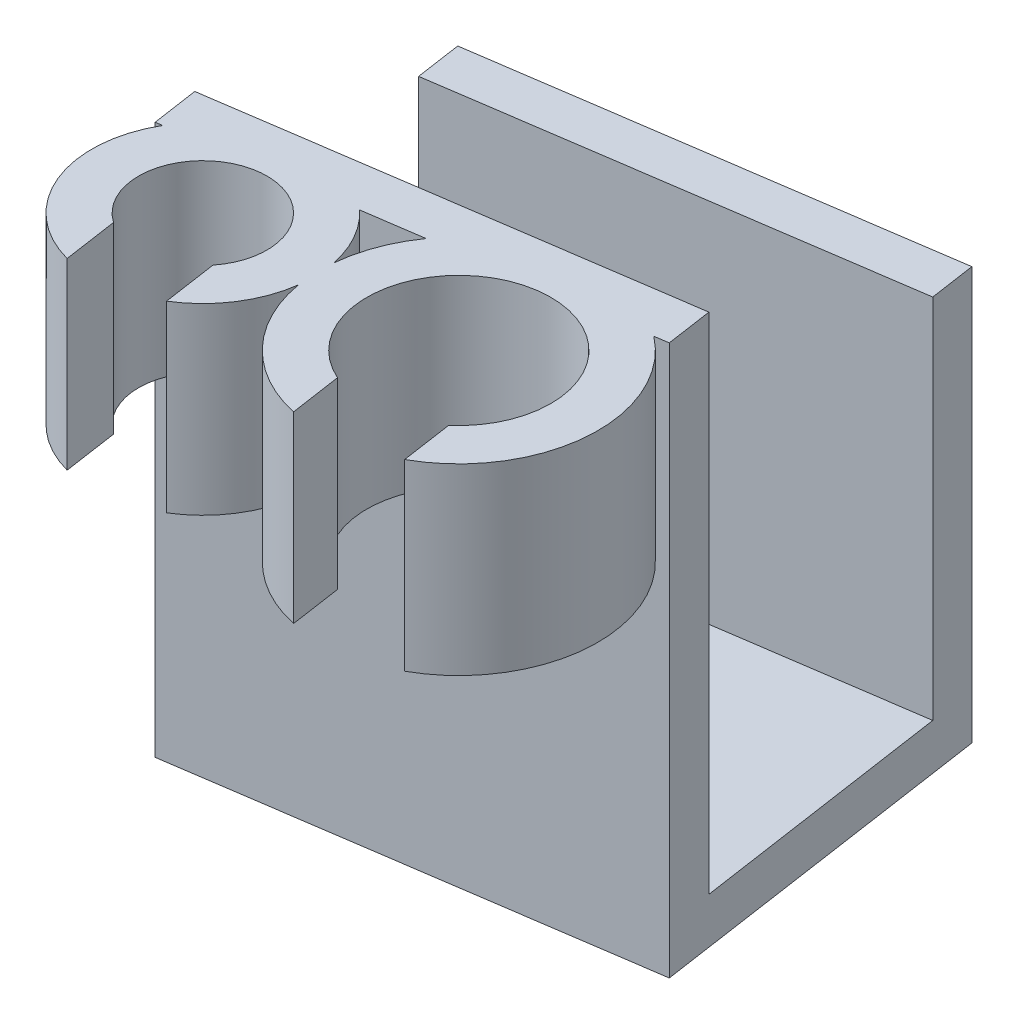
ISO-10303-21;
HEADER;
FILE_DESCRIPTION(('STEP AP214'),'2;1');
FILE_NAME('part.step','',(''),(''),'','','');
FILE_SCHEMA(('AUTOMOTIVE_DESIGN { 1 0 10303 214 1 1 1 1 }'));
ENDSEC;
DATA;
#1=APPLICATION_CONTEXT('core data for automotive mechanical design processes');
#2=APPLICATION_PROTOCOL_DEFINITION('international standard','automotive_design',2000,#1);
#3=PRODUCT_CONTEXT('',#1,'mechanical');
#4=PRODUCT('Part','Part','',(#3));
#5=PRODUCT_RELATED_PRODUCT_CATEGORY('part','',(#4));
#6=PRODUCT_DEFINITION_FORMATION('','',#4);
#7=PRODUCT_DEFINITION_CONTEXT('part definition',#1,'design');
#8=PRODUCT_DEFINITION('design','',#6,#7);
#9=PRODUCT_DEFINITION_SHAPE('','',#8);
#10=(LENGTH_UNIT() NAMED_UNIT(*) SI_UNIT(.MILLI.,.METRE.));
#11=(NAMED_UNIT(*) PLANE_ANGLE_UNIT() SI_UNIT($,.RADIAN.));
#12=(NAMED_UNIT(*) SI_UNIT($,.STERADIAN.) SOLID_ANGLE_UNIT());
#13=UNCERTAINTY_MEASURE_WITH_UNIT(LENGTH_MEASURE(1.E-05),#10,'distance_accuracy_value','');
#14=(GEOMETRIC_REPRESENTATION_CONTEXT(3) GLOBAL_UNCERTAINTY_ASSIGNED_CONTEXT((#13)) GLOBAL_UNIT_ASSIGNED_CONTEXT((#10,
#11,#12)) REPRESENTATION_CONTEXT('',''));
#15=CARTESIAN_POINT('',(0.,0.,0.));
#16=DIRECTION('',(0.,0.,1.));
#17=DIRECTION('',(1.,0.,0.));
#18=AXIS2_PLACEMENT_3D('',#15,#16,#17);
#19=CARTESIAN_POINT('',(0.,12.7,0.));
#20=DIRECTION('',(0.,-1.,0.));
#21=DIRECTION('',(0.,0.,-1.));
#22=AXIS2_PLACEMENT_3D('',#19,#20,#21);
#23=CYLINDRICAL_SURFACE('',#22,7.6835);
#24=CARTESIAN_POINT('',(0.,0.,0.));
#25=DIRECTION('',(0.,1.,0.));
#26=DIRECTION('',(0.,0.,1.));
#27=AXIS2_PLACEMENT_3D('',#24,#25,#26);
#28=CIRCLE('',#27,7.6835);
#29=CARTESIAN_POINT('',(-6.64082427645211,0.,-3.86466365668272));
#30=VERTEX_POINT('',#29);
#31=CARTESIAN_POINT('',(-1.9731548501213,0.,7.42582198732523));
#32=VERTEX_POINT('',#31);
#33=EDGE_CURVE('E223',#30,#32,#28,.T.);
#34=ORIENTED_EDGE('',*,*,#33,.T.);
#35=DIRECTION('',(0.,-1.,0.));
#36=VECTOR('',#35,1.);
#37=CARTESIAN_POINT('',(-1.9731548501213,12.7,7.42582198732523));
#38=LINE('',#37,#36);
#39=CARTESIAN_POINT('',(-1.9731548501213,12.7,7.42582198732523));
#40=VERTEX_POINT('',#39);
#41=EDGE_CURVE('E538',#32,#40,#38,.F.);
#42=ORIENTED_EDGE('',*,*,#41,.T.);
#43=CARTESIAN_POINT('',(0.,12.7,0.));
#44=DIRECTION('',(0.,1.,0.));
#45=DIRECTION('',(0.,0.,1.));
#46=AXIS2_PLACEMENT_3D('',#43,#44,#45);
#47=CIRCLE('',#46,7.6835);
#48=CARTESIAN_POINT('',(-6.64082427645211,12.7,-3.86466365668272));
#49=VERTEX_POINT('',#48);
#50=EDGE_CURVE('E210',#49,#40,#47,.T.);
#51=ORIENTED_EDGE('',*,*,#50,.F.);
#52=DIRECTION('',(0.,-1.,0.));
#53=VECTOR('',#52,1.);
#54=CARTESIAN_POINT('',(-6.64082427645211,12.7,-3.86466365668272));
#55=LINE('',#54,#53);
#56=EDGE_CURVE('E229',#49,#30,#55,.T.);
#57=ORIENTED_EDGE('',*,*,#56,.T.);
#58=EDGE_LOOP('',(#34,#42,#51,#57));
#59=FACE_BOUND('',#58,.T.);
#60=ADVANCED_FACE('F39',(#59),#23,.T.);
#61=CARTESIAN_POINT('',(17.1097375292608,12.7,-0.624264613609993));
#62=DIRECTION('',(0.,-1.,0.));
#63=DIRECTION('',(0.,0.,-1.));
#64=AXIS2_PLACEMENT_3D('',#61,#62,#63);
#65=CYLINDRICAL_SURFACE('',#64,9.6266);
#66=CARTESIAN_POINT('',(17.1097375292608,12.7,-0.624264613609993));
#67=DIRECTION('',(0.,1.,0.));
#68=DIRECTION('',(0.,0.,1.));
#69=AXIS2_PLACEMENT_3D('',#66,#67,#68);
#70=CIRCLE('',#69,9.6266);
#71=CARTESIAN_POINT('',(21.775945445724,12.7,7.79582631466009));
#72=VERTEX_POINT('',#71);
#73=CARTESIAN_POINT('',(23.0106900346474,12.7,-8.23019566044256));
#74=VERTEX_POINT('',#73);
#75=EDGE_CURVE('E249',#72,#74,#70,.T.);
#76=ORIENTED_EDGE('',*,*,#75,.F.);
#77=DIRECTION('',(0.,-1.,0.));
#78=VECTOR('',#77,1.);
#79=CARTESIAN_POINT('',(21.775945445724,12.7,7.79582631466009));
#80=LINE('',#79,#78);
#81=CARTESIAN_POINT('',(21.775945445724,0.,7.79582631466009));
#82=VERTEX_POINT('',#81);
#83=EDGE_CURVE('E286',#72,#82,#80,.T.);
#84=ORIENTED_EDGE('',*,*,#83,.T.);
#85=CARTESIAN_POINT('',(17.1097375292608,0.,-0.624264613609993));
#86=DIRECTION('',(0.,1.,0.));
#87=DIRECTION('',(0.,0.,1.));
#88=AXIS2_PLACEMENT_3D('',#85,#86,#87);
#89=CIRCLE('',#88,9.6266);
#90=CARTESIAN_POINT('',(23.0106900346474,0.,-8.23019566044256));
#91=VERTEX_POINT('',#90);
#92=EDGE_CURVE('E258',#82,#91,#89,.T.);
#93=ORIENTED_EDGE('',*,*,#92,.T.);
#94=DIRECTION('',(0.,-1.,0.));
#95=VECTOR('',#94,1.);
#96=CARTESIAN_POINT('',(23.0106900346474,12.7,-8.23019566044256));
#97=LINE('',#96,#95);
#98=EDGE_CURVE('E373',#91,#74,#97,.F.);
#99=ORIENTED_EDGE('',*,*,#98,.T.);
#100=EDGE_LOOP('',(#76,#84,#93,#99));
#101=FACE_BOUND('',#100,.T.);
#102=ADVANCED_FACE('F418',(#101),#65,.T.);
#103=CARTESIAN_POINT('',(-10.7170233766424,-22.225,-28.3734396883365));
#104=DIRECTION('',(0.,-1.,0.));
#105=DIRECTION('',(1.,0.,0.));
#106=AXIS2_PLACEMENT_3D('',#103,#104,#105);
#107=PLANE('',#106);
#108=DIRECTION('',(0.989335034779027,0.,-0.145657780289216));
#109=VECTOR('',#108,1.);
#110=CARTESIAN_POINT('',(-10.2495745992708,-22.225,-25.1984396883365));
#111=LINE('',#110,#109);
#112=CARTESIAN_POINT('',(-10.2495745992708,-22.225,-25.1984396883365));
#113=VERTEX_POINT('',#112);
#114=CARTESIAN_POINT('',(20.7929100793454,-22.225,-29.7687614236414));
#115=VERTEX_POINT('',#114);
#116=EDGE_CURVE('E291',#113,#115,#111,.T.);
#117=ORIENTED_EDGE('',*,*,#116,.F.);
#118=DIRECTION('',(0.145657780289216,0.,0.989335034779027));
#119=VECTOR('',#118,1.);
#120=CARTESIAN_POINT('',(-10.7170233766424,-22.225,-28.3734396883365));
#121=LINE('',#120,#119);
#122=CARTESIAN_POINT('',(-7.57227190019819,-22.225,-7.01369628745728));
#123=VERTEX_POINT('',#122);
#124=EDGE_CURVE('E338',#113,#123,#121,.T.);
#125=ORIENTED_EDGE('',*,*,#124,.T.);
#126=DIRECTION('',(0.989335034779027,0.,-0.145657780289216));
#127=VECTOR('',#126,1.);
#128=CARTESIAN_POINT('',(-7.57227190019819,-22.225,-7.01369628745728));
#129=LINE('',#128,#127);
#130=CARTESIAN_POINT('',(23.4702127784181,-22.225,-11.5840180227622));
#131=VERTEX_POINT('',#130);
#132=EDGE_CURVE('E320',#123,#131,#129,.T.);
#133=ORIENTED_EDGE('',*,*,#132,.T.);
#134=DIRECTION('',(0.145657780289216,0.,0.989335034779027));
#135=VECTOR('',#134,1.);
#136=CARTESIAN_POINT('',(20.3254613019739,-22.225,-32.9437614236414));
#137=LINE('',#136,#135);
#138=EDGE_CURVE('E332',#115,#131,#137,.T.);
#139=ORIENTED_EDGE('',*,*,#138,.F.);
#140=EDGE_LOOP('',(#117,#125,#133,#139));
#141=FACE_BOUND('',#140,.T.);
#142=ADVANCED_FACE('F433',(#141),#107,.F.);
#143=CARTESIAN_POINT('',(-7.57227190019819,-25.4,-7.01369628745728));
#144=DIRECTION('',(-0.145657780289216,0.,-0.989335034779027));
#145=DIRECTION('',(-0.989335034779027,0.,0.145657780289216));
#146=AXIS2_PLACEMENT_3D('',#143,#144,#145);
#147=PLANE('',#146);
#148=DIRECTION('',(0.,1.,0.));
#149=VECTOR('',#148,1.);
#150=CARTESIAN_POINT('',(23.4702127784181,-25.4,-11.5840180227622));
#151=LINE('',#150,#149);
#152=CARTESIAN_POINT('',(23.4702127784181,12.7,-11.5840180227622));
#153=VERTEX_POINT('',#152);
#154=EDGE_CURVE('E374',#131,#153,#151,.T.);
#155=ORIENTED_EDGE('',*,*,#154,.F.);
#156=ORIENTED_EDGE('',*,*,#132,.F.);
#157=DIRECTION('',(0.,1.,0.));
#158=VECTOR('',#157,1.);
#159=CARTESIAN_POINT('',(-7.57227190019819,-25.4,-7.01369628745728));
#160=LINE('',#159,#158);
#161=CARTESIAN_POINT('',(-7.57227190019819,12.7,-7.01369628745728));
#162=VERTEX_POINT('',#161);
#163=EDGE_CURVE('E370',#123,#162,#160,.T.);
#164=ORIENTED_EDGE('',*,*,#163,.T.);
#165=DIRECTION('',(-0.989335034779027,0.,0.145657780289216));
#166=VECTOR('',#165,1.);
#167=CARTESIAN_POINT('',(-7.57227190019819,12.7,-7.01369628745728));
#168=LINE('',#167,#166);
#169=EDGE_CURVE('E347',#153,#162,#168,.T.);
#170=ORIENTED_EDGE('',*,*,#169,.F.);
#171=EDGE_LOOP('',(#155,#156,#164,#170));
#172=FACE_BOUND('',#171,.T.);
#173=ADVANCED_FACE('F437',(#172),#147,.T.);
#174=CARTESIAN_POINT('',(4.02961562687628,12.7,6.54204632738369));
#175=VERTEX_POINT('',#174);
#176=CARTESIAN_POINT('',(7.61945155231347,12.7,0.990015298845361));
#177=VERTEX_POINT('',#176);
#178=EDGE_CURVE('E244',#175,#177,#47,.T.);
#179=ORIENTED_EDGE('',*,*,#178,.F.);
#180=DIRECTION('',(0.,-1.,0.));
#181=VECTOR('',#180,1.);
#182=CARTESIAN_POINT('',(4.02961562687628,12.7,6.54204632738369));
#183=LINE('',#182,#181);
#184=CARTESIAN_POINT('',(4.02961562687628,0.,6.54204632738369));
#185=VERTEX_POINT('',#184);
#186=EDGE_CURVE('E522',#175,#185,#183,.T.);
#187=ORIENTED_EDGE('',*,*,#186,.T.);
#188=CARTESIAN_POINT('',(7.61945155231347,0.,0.990015298845361));
#189=VERTEX_POINT('',#188);
#190=EDGE_CURVE('E218',#185,#189,#28,.T.);
#191=ORIENTED_EDGE('',*,*,#190,.T.);
#192=DIRECTION('',(0.,-1.,0.));
#193=VECTOR('',#192,1.);
#194=CARTESIAN_POINT('',(7.61945155231347,12.7,0.990015298845361));
#195=LINE('',#194,#193);
#196=EDGE_CURVE('E262',#177,#189,#195,.T.);
#197=ORIENTED_EDGE('',*,*,#196,.F.);
#198=EDGE_LOOP('',(#179,#187,#191,#197));
#199=FACE_BOUND('',#198,.T.);
#200=ADVANCED_FACE('F429',(#199),#23,.T.);
#201=CARTESIAN_POINT('',(9.26708104546722,12.7,-6.20675212700493));
#202=VERTEX_POINT('',#201);
#203=CARTESIAN_POINT('',(7.52704494171322,12.7,-1.54264924575532));
#204=VERTEX_POINT('',#203);
#205=EDGE_CURVE('E243',#202,#204,#70,.T.);
#206=ORIENTED_EDGE('',*,*,#205,.F.);
#207=DIRECTION('',(0.,-1.,0.));
#208=VECTOR('',#207,1.);
#209=CARTESIAN_POINT('',(9.26708104546721,12.7,-6.20675212700493));
#210=LINE('',#209,#208);
#211=CARTESIAN_POINT('',(9.26708104546721,0.,-6.20675212700493));
#212=VERTEX_POINT('',#211);
#213=EDGE_CURVE('E386',#202,#212,#210,.T.);
#214=ORIENTED_EDGE('',*,*,#213,.T.);
#215=CARTESIAN_POINT('',(7.52704494171322,0.,-1.54264924575532));
#216=VERTEX_POINT('',#215);
#217=EDGE_CURVE('E253',#212,#216,#89,.T.);
#218=ORIENTED_EDGE('',*,*,#217,.T.);
#219=DIRECTION('',(0.,-1.,0.));
#220=VECTOR('',#219,1.);
#221=CARTESIAN_POINT('',(7.52704494171322,12.7,-1.54264924575532));
#222=LINE('',#221,#220);
#223=EDGE_CURVE('E248',#204,#216,#222,.T.);
#224=ORIENTED_EDGE('',*,*,#223,.F.);
#225=EDGE_LOOP('',(#206,#214,#218,#224));
#226=FACE_BOUND('',#225,.T.);
#227=ADVANCED_FACE('F434',(#226),#65,.T.);
#228=CARTESIAN_POINT('',(5.24520866029501,0.,-5.61462005481816));
#229=VERTEX_POINT('',#228);
#230=EDGE_CURVE('E225',#216,#229,#28,.T.);
#231=ORIENTED_EDGE('',*,*,#230,.T.);
#232=DIRECTION('',(0.,-1.,0.));
#233=VECTOR('',#232,1.);
#234=CARTESIAN_POINT('',(5.24520866029501,12.7,-5.61462005481816));
#235=LINE('',#234,#233);
#236=CARTESIAN_POINT('',(5.24520866029501,12.7,-5.61462005481816));
#237=VERTEX_POINT('',#236);
#238=EDGE_CURVE('E389',#229,#237,#235,.F.);
#239=ORIENTED_EDGE('',*,*,#238,.T.);
#240=EDGE_CURVE('E239',#204,#237,#47,.T.);
#241=ORIENTED_EDGE('',*,*,#240,.F.);
#242=ORIENTED_EDGE('',*,*,#223,.T.);
#243=EDGE_LOOP('',(#231,#239,#241,#242));
#244=FACE_BOUND('',#243,.T.);
#245=ADVANCED_FACE('F41',(#244),#23,.T.);
#246=CARTESIAN_POINT('',(15.0682712888285,0.,8.78338350636003));
#247=VERTEX_POINT('',#246);
#248=EDGE_CURVE('E254',#189,#247,#89,.T.);
#249=ORIENTED_EDGE('',*,*,#248,.T.);
#250=DIRECTION('',(0.,-1.,0.));
#251=VECTOR('',#250,1.);
#252=CARTESIAN_POINT('',(15.0682712888285,12.7,8.78338350636002));
#253=LINE('',#252,#251);
#254=CARTESIAN_POINT('',(15.0682712888285,12.7,8.78338350636002));
#255=VERTEX_POINT('',#254);
#256=EDGE_CURVE('E287',#247,#255,#253,.F.);
#257=ORIENTED_EDGE('',*,*,#256,.T.);
#258=EDGE_CURVE('E245',#177,#255,#70,.T.);
#259=ORIENTED_EDGE('',*,*,#258,.F.);
#260=ORIENTED_EDGE('',*,*,#196,.T.);
#261=EDGE_LOOP('',(#249,#257,#259,#260));
#262=FACE_BOUND('',#261,.T.);
#263=ADVANCED_FACE('F435',(#262),#65,.T.);
#264=CARTESIAN_POINT('',(8.5548687646304,12.7,-0.312132306804996));
#265=DIRECTION('',(0.,1.,0.));
#266=DIRECTION('',(0.,0.,1.));
#267=AXIS2_PLACEMENT_3D('',#264,#265,#266);
#268=PLANE('',#267);
#269=DIRECTION('',(0.145657780289218,0.,0.989335034779027));
#270=VECTOR('',#269,1.);
#271=CARTESIAN_POINT('',(-1.67597187663482,12.7,9.44434462872615));
#272=LINE('',#271,#270);
#273=CARTESIAN_POINT('',(-2.52817795033,12.7,3.65600071819812));
#274=VERTEX_POINT('',#273);
#275=EDGE_CURVE('E190',#274,#40,#272,.T.);
#276=ORIENTED_EDGE('',*,*,#275,.F.);
#277=CARTESIAN_POINT('',(0.,12.7,0.));
#278=DIRECTION('',(0.,-1.,0.));
#279=DIRECTION('',(0.,0.,-1.));
#280=AXIS2_PLACEMENT_3D('',#277,#278,#279);
#281=CIRCLE('',#280,4.445);
#282=CARTESIAN_POINT('',(3.47459252666759,12.7,2.77222505825659));
#283=VERTEX_POINT('',#282);
#284=EDGE_CURVE('E207',#274,#283,#281,.T.);
#285=ORIENTED_EDGE('',*,*,#284,.T.);
#286=DIRECTION('',(-0.145657780289218,0.,-0.989335034779027));
#287=VECTOR('',#286,1.);
#288=CARTESIAN_POINT('',(3.47459252666759,12.7,2.77222505825659));
#289=LINE('',#288,#287);
#290=EDGE_CURVE('E212',#175,#283,#289,.T.);
#291=ORIENTED_EDGE('',*,*,#290,.F.);
#292=ORIENTED_EDGE('',*,*,#178,.T.);
#293=ORIENTED_EDGE('',*,*,#258,.T.);
#294=DIRECTION('',(0.145657780289216,0.,0.989335034779027));
#295=VECTOR('',#294,1.);
#296=CARTESIAN_POINT('',(14.542367286504,12.7,5.21134462593021));
#297=LINE('',#296,#295);
#298=CARTESIAN_POINT('',(14.542367286504,12.7,5.21134462593021));
#299=VERTEX_POINT('',#298);
#300=EDGE_CURVE('E213',#299,#255,#297,.T.);
#301=ORIENTED_EDGE('',*,*,#300,.F.);
#302=CARTESIAN_POINT('',(17.1097375292608,12.7,-0.624264613609993));
#303=DIRECTION('',(0.,-1.,0.));
#304=DIRECTION('',(0.,0.,-1.));
#305=AXIS2_PLACEMENT_3D('',#302,#303,#304);
#306=CIRCLE('',#305,6.3754);
#307=CARTESIAN_POINT('',(21.2500414433995,12.7,4.22378743423027));
#308=VERTEX_POINT('',#307);
#309=EDGE_CURVE('E226',#299,#308,#306,.T.);
#310=ORIENTED_EDGE('',*,*,#309,.T.);
#311=DIRECTION('',(-0.145657780289216,0.,-0.989335034779027));
#312=VECTOR('',#311,1.);
#313=CARTESIAN_POINT('',(21.2500414433995,12.7,4.22378743423027));
#314=LINE('',#313,#312);
#315=EDGE_CURVE('E63',#72,#308,#314,.T.);
#316=ORIENTED_EDGE('',*,*,#315,.F.);
#317=ORIENTED_EDGE('',*,*,#75,.T.);
#318=DIRECTION('',(0.989335034779027,0.,-0.145657780289217));
#319=VECTOR('',#318,1.);
#320=CARTESIAN_POINT('',(-7.09872084636227,12.7,-3.79724847817339));
#321=LINE('',#320,#319);
#322=CARTESIAN_POINT('',(23.943763832254,12.7,-8.36757021347834));
#323=VERTEX_POINT('',#322);
#324=EDGE_CURVE('E358',#74,#323,#321,.T.);
#325=ORIENTED_EDGE('',*,*,#324,.T.);
#326=DIRECTION('',(-0.145657780289215,0.,-0.989335034779027));
#327=VECTOR('',#326,1.);
#328=CARTESIAN_POINT('',(23.4702127784181,12.7,-11.5840180227622));
#329=LINE('',#328,#327);
#330=EDGE_CURVE('E362',#323,#153,#329,.T.);
#331=ORIENTED_EDGE('',*,*,#330,.T.);
#332=ORIENTED_EDGE('',*,*,#169,.T.);
#333=DIRECTION('',(0.145657780289217,0.,0.989335034779027));
#334=VECTOR('',#333,1.);
#335=CARTESIAN_POINT('',(-7.57227190019819,12.7,-7.01369628745728));
#336=LINE('',#335,#334);
#337=CARTESIAN_POINT('',(-7.09872084636227,12.7,-3.79724847817339));
#338=VERTEX_POINT('',#337);
#339=EDGE_CURVE('E341',#162,#338,#336,.T.);
#340=ORIENTED_EDGE('',*,*,#339,.T.);
#341=EDGE_CURVE('E359',#338,#49,#321,.T.);
#342=ORIENTED_EDGE('',*,*,#341,.T.);
#343=ORIENTED_EDGE('',*,*,#50,.T.);
#344=EDGE_LOOP('',(#276,#285,#291,#292,#293,#301,#310,#316,#317,#325,#331,#332,#340,#342,#343));
#345=FACE_BOUND('',#344,.T.);
#346=ORIENTED_EDGE('',*,*,#240,.T.);
#347=EDGE_CURVE('E363',#237,#202,#321,.T.);
#348=ORIENTED_EDGE('',*,*,#347,.T.);
#349=ORIENTED_EDGE('',*,*,#205,.T.);
#350=EDGE_LOOP('',(#346,#348,#349));
#351=FACE_BOUND('',#350,.T.);
#352=ADVANCED_FACE('F204',(#345,#351),#268,.T.);
#353=CARTESIAN_POINT('',(8.5548687646304,0.,-0.312132306804996));
#354=DIRECTION('',(0.,1.,0.));
#355=DIRECTION('',(0.,0.,1.));
#356=AXIS2_PLACEMENT_3D('',#353,#354,#355);
#357=PLANE('',#356);
#358=CARTESIAN_POINT('',(0.,0.,0.));
#359=DIRECTION('',(0.,-1.,0.));
#360=DIRECTION('',(0.,0.,-1.));
#361=AXIS2_PLACEMENT_3D('',#358,#359,#360);
#362=CIRCLE('',#361,4.445);
#363=CARTESIAN_POINT('',(-2.52817795033,0.,3.65600071819812));
#364=VERTEX_POINT('',#363);
#365=CARTESIAN_POINT('',(3.47459252666759,0.,2.77222505825659));
#366=VERTEX_POINT('',#365);
#367=EDGE_CURVE('E219',#364,#366,#362,.T.);
#368=ORIENTED_EDGE('',*,*,#367,.F.);
#369=DIRECTION('',(0.145657780289218,0.,0.989335034779027));
#370=VECTOR('',#369,1.);
#371=CARTESIAN_POINT('',(-2.86486314793633,0.,1.36917154215243));
#372=LINE('',#371,#370);
#373=EDGE_CURVE('E193',#364,#32,#372,.T.);
#374=ORIENTED_EDGE('',*,*,#373,.T.);
#375=ORIENTED_EDGE('',*,*,#33,.F.);
#376=DIRECTION('',(0.989335034779027,0.,-0.145657780289217));
#377=VECTOR('',#376,1.);
#378=CARTESIAN_POINT('',(7.72053886598938,0.,-5.97905787473709));
#379=LINE('',#378,#377);
#380=EDGE_CURVE('E270',#30,#229,#379,.T.);
#381=ORIENTED_EDGE('',*,*,#380,.T.);
#382=ORIENTED_EDGE('',*,*,#230,.F.);
#383=ORIENTED_EDGE('',*,*,#217,.F.);
#384=EDGE_CURVE('E266',#212,#91,#379,.T.);
#385=ORIENTED_EDGE('',*,*,#384,.T.);
#386=ORIENTED_EDGE('',*,*,#92,.F.);
#387=DIRECTION('',(-0.145657780289216,0.,-0.989335034779027));
#388=VECTOR('',#387,1.);
#389=CARTESIAN_POINT('',(20.3270525171461,0.,-2.04532692164161));
#390=LINE('',#389,#388);
#391=CARTESIAN_POINT('',(21.2500414433995,0.,4.22378743423027));
#392=VERTEX_POINT('',#391);
#393=EDGE_CURVE('E283',#82,#392,#390,.T.);
#394=ORIENTED_EDGE('',*,*,#393,.T.);
#395=CARTESIAN_POINT('',(17.1097375292608,0.,-0.624264613609993));
#396=DIRECTION('',(0.,-1.,0.));
#397=DIRECTION('',(0.,0.,-1.));
#398=AXIS2_PLACEMENT_3D('',#395,#396,#397);
#399=CIRCLE('',#398,6.3754);
#400=CARTESIAN_POINT('',(14.542367286504,0.,5.21134462593021));
#401=VERTEX_POINT('',#400);
#402=EDGE_CURVE('E235',#401,#392,#399,.T.);
#403=ORIENTED_EDGE('',*,*,#402,.F.);
#404=DIRECTION('',(0.145657780289216,0.,0.989335034779027));
#405=VECTOR('',#404,1.);
#406=CARTESIAN_POINT('',(13.6193783602506,0.,-1.05776972994168));
#407=LINE('',#406,#405);
#408=EDGE_CURVE('E55',#401,#247,#407,.T.);
#409=ORIENTED_EDGE('',*,*,#408,.T.);
#410=ORIENTED_EDGE('',*,*,#248,.F.);
#411=ORIENTED_EDGE('',*,*,#190,.F.);
#412=DIRECTION('',(-0.145657780289218,0.,-0.989335034779027));
#413=VECTOR('',#412,1.);
#414=CARTESIAN_POINT('',(3.13790732906126,0.,0.485395882210897));
#415=LINE('',#414,#413);
#416=EDGE_CURVE('E525',#185,#366,#415,.T.);
#417=ORIENTED_EDGE('',*,*,#416,.T.);
#418=EDGE_LOOP('',(#368,#374,#375,#381,#382,#383,#385,#386,#394,#403,#409,#410,#411,#417));
#419=FACE_BOUND('',#418,.T.);
#420=ADVANCED_FACE('F280',(#419),#357,.F.);
#421=CARTESIAN_POINT('',(17.1097375292608,12.7,-0.624264613609993));
#422=DIRECTION('',(0.,-1.,0.));
#423=DIRECTION('',(0.,0.,-1.));
#424=AXIS2_PLACEMENT_3D('',#421,#422,#423);
#425=CYLINDRICAL_SURFACE('',#424,6.3754);
#426=ORIENTED_EDGE('',*,*,#402,.T.);
#427=DIRECTION('',(0.,-1.,0.));
#428=VECTOR('',#427,1.);
#429=CARTESIAN_POINT('',(21.2500414433995,12.7,4.22378743423027));
#430=LINE('',#429,#428);
#431=EDGE_CURVE('E11',#392,#308,#430,.F.);
#432=ORIENTED_EDGE('',*,*,#431,.T.);
#433=ORIENTED_EDGE('',*,*,#309,.F.);
#434=DIRECTION('',(0.,-1.,0.));
#435=VECTOR('',#434,1.);
#436=CARTESIAN_POINT('',(14.542367286504,12.7,5.21134462593021));
#437=LINE('',#436,#435);
#438=EDGE_CURVE('E48',#299,#401,#437,.T.);
#439=ORIENTED_EDGE('',*,*,#438,.T.);
#440=EDGE_LOOP('',(#426,#432,#433,#439));
#441=FACE_BOUND('',#440,.T.);
#442=ADVANCED_FACE('F276',(#441),#425,.F.);
#443=CARTESIAN_POINT('',(0.,12.7,0.));
#444=DIRECTION('',(0.,-1.,0.));
#445=DIRECTION('',(0.,0.,-1.));
#446=AXIS2_PLACEMENT_3D('',#443,#444,#445);
#447=CYLINDRICAL_SURFACE('',#446,4.445);
#448=ORIENTED_EDGE('',*,*,#284,.F.);
#449=DIRECTION('',(0.,-1.,0.));
#450=VECTOR('',#449,1.);
#451=CARTESIAN_POINT('',(-2.52817795033,12.7,3.65600071819812));
#452=LINE('',#451,#450);
#453=EDGE_CURVE('E187',#274,#364,#452,.T.);
#454=ORIENTED_EDGE('',*,*,#453,.T.);
#455=ORIENTED_EDGE('',*,*,#367,.T.);
#456=DIRECTION('',(0.,-1.,0.));
#457=VECTOR('',#456,1.);
#458=CARTESIAN_POINT('',(3.47459252666759,12.7,2.77222505825659));
#459=LINE('',#458,#457);
#460=EDGE_CURVE('E199',#366,#283,#459,.F.);
#461=ORIENTED_EDGE('',*,*,#460,.T.);
#462=EDGE_LOOP('',(#448,#454,#455,#461));
#463=FACE_BOUND('',#462,.T.);
#464=ADVANCED_FACE('F216',(#463),#447,.F.);
#465=CARTESIAN_POINT('',(-7.09872084636227,-25.4,-3.79724847817339));
#466=DIRECTION('',(0.145657780289217,0.,0.989335034779027));
#467=DIRECTION('',(0.989335034779027,0.,-0.145657780289217));
#468=AXIS2_PLACEMENT_3D('',#465,#466,#467);
#469=PLANE('',#468);
#470=ORIENTED_EDGE('',*,*,#56,.F.);
#471=ORIENTED_EDGE('',*,*,#341,.F.);
#472=DIRECTION('',(0.,1.,0.));
#473=VECTOR('',#472,1.);
#474=CARTESIAN_POINT('',(-7.09872084636227,-25.4,-3.79724847817339));
#475=LINE('',#474,#473);
#476=CARTESIAN_POINT('',(-7.09872084636227,-25.4,-3.79724847817339));
#477=VERTEX_POINT('',#476);
#478=EDGE_CURVE('E354',#477,#338,#475,.T.);
#479=ORIENTED_EDGE('',*,*,#478,.F.);
#480=DIRECTION('',(0.989335034779027,0.,-0.145657780289217));
#481=VECTOR('',#480,1.);
#482=CARTESIAN_POINT('',(-7.09872084636227,-25.4,-3.79724847817339));
#483=LINE('',#482,#481);
#484=CARTESIAN_POINT('',(23.943763832254,-25.4,-8.36757021347834));
#485=VERTEX_POINT('',#484);
#486=EDGE_CURVE('E346',#477,#485,#483,.T.);
#487=ORIENTED_EDGE('',*,*,#486,.T.);
#488=DIRECTION('',(0.,1.,0.));
#489=VECTOR('',#488,1.);
#490=CARTESIAN_POINT('',(23.943763832254,-25.4,-8.36757021347834));
#491=LINE('',#490,#489);
#492=EDGE_CURVE('E377',#485,#323,#491,.T.);
#493=ORIENTED_EDGE('',*,*,#492,.T.);
#494=ORIENTED_EDGE('',*,*,#324,.F.);
#495=ORIENTED_EDGE('',*,*,#98,.F.);
#496=ORIENTED_EDGE('',*,*,#384,.F.);
#497=ORIENTED_EDGE('',*,*,#213,.F.);
#498=ORIENTED_EDGE('',*,*,#347,.F.);
#499=ORIENTED_EDGE('',*,*,#238,.F.);
#500=ORIENTED_EDGE('',*,*,#380,.F.);
#501=EDGE_LOOP('',(#470,#471,#479,#487,#493,#494,#495,#496,#497,#498,#499,#500));
#502=FACE_BOUND('',#501,.T.);
#503=ADVANCED_FACE('F415',(#502),#469,.T.);
#504=CARTESIAN_POINT('',(-7.57227190019819,-25.4,-7.01369628745728));
#505=DIRECTION('',(-0.989335034779027,0.,0.145657780289217));
#506=DIRECTION('',(0.145657780289217,0.,0.989335034779027));
#507=AXIS2_PLACEMENT_3D('',#504,#505,#506);
#508=PLANE('',#507);
#509=ORIENTED_EDGE('',*,*,#339,.F.);
#510=ORIENTED_EDGE('',*,*,#163,.F.);
#511=ORIENTED_EDGE('',*,*,#124,.F.);
#512=DIRECTION('',(0.,-1.,0.));
#513=VECTOR('',#512,1.);
#514=CARTESIAN_POINT('',(-10.2495745992708,3.175,-25.1984396883365));
#515=LINE('',#514,#513);
#516=CARTESIAN_POINT('',(-10.2495745992708,3.175,-25.1984396883365));
#517=VERTEX_POINT('',#516);
#518=EDGE_CURVE('E317',#517,#113,#515,.T.);
#519=ORIENTED_EDGE('',*,*,#518,.F.);
#520=DIRECTION('',(0.145657780289216,0.,0.989335034779027));
#521=VECTOR('',#520,1.);
#522=CARTESIAN_POINT('',(-10.7170233766424,3.175,-28.3734396883365));
#523=LINE('',#522,#521);
#524=CARTESIAN_POINT('',(-10.7170233766424,3.175,-28.3734396883365));
#525=VERTEX_POINT('',#524);
#526=EDGE_CURVE('E301',#525,#517,#523,.T.);
#527=ORIENTED_EDGE('',*,*,#526,.F.);
#528=DIRECTION('',(0.,1.,0.));
#529=VECTOR('',#528,1.);
#530=CARTESIAN_POINT('',(-10.7170233766424,-25.4,-28.3734396883365));
#531=LINE('',#530,#529);
#532=CARTESIAN_POINT('',(-10.7170233766424,-25.4,-28.3734396883365));
#533=VERTEX_POINT('',#532);
#534=EDGE_CURVE('E325',#533,#525,#531,.T.);
#535=ORIENTED_EDGE('',*,*,#534,.F.);
#536=DIRECTION('',(0.145657780289217,0.,0.989335034779027));
#537=VECTOR('',#536,1.);
#538=CARTESIAN_POINT('',(-7.57227190019819,-25.4,-7.01369628745728));
#539=LINE('',#538,#537);
#540=EDGE_CURVE('E342',#533,#477,#539,.T.);
#541=ORIENTED_EDGE('',*,*,#540,.T.);
#542=ORIENTED_EDGE('',*,*,#478,.T.);
#543=EDGE_LOOP('',(#509,#510,#511,#519,#527,#535,#541,#542));
#544=FACE_BOUND('',#543,.T.);
#545=ADVANCED_FACE('F462',(#544),#508,.T.);
#546=CARTESIAN_POINT('',(23.4702127784181,-25.4,-11.5840180227622));
#547=DIRECTION('',(0.989335034779027,0.,-0.145657780289215));
#548=DIRECTION('',(-0.145657780289215,0.,-0.989335034779027));
#549=AXIS2_PLACEMENT_3D('',#546,#547,#548);
#550=PLANE('',#549);
#551=ORIENTED_EDGE('',*,*,#330,.F.);
#552=ORIENTED_EDGE('',*,*,#492,.F.);
#553=DIRECTION('',(-0.145657780289215,0.,-0.989335034779027));
#554=VECTOR('',#553,1.);
#555=CARTESIAN_POINT('',(23.4702127784181,-25.4,-11.5840180227622));
#556=LINE('',#555,#554);
#557=CARTESIAN_POINT('',(20.3254613019739,-25.4,-32.9437614236414));
#558=VERTEX_POINT('',#557);
#559=EDGE_CURVE('E351',#485,#558,#556,.T.);
#560=ORIENTED_EDGE('',*,*,#559,.T.);
#561=DIRECTION('',(0.,-1.,0.));
#562=VECTOR('',#561,1.);
#563=CARTESIAN_POINT('',(20.3254613019739,-22.225,-32.9437614236414));
#564=LINE('',#563,#562);
#565=CARTESIAN_POINT('',(20.3254613019739,3.175,-32.9437614236414));
#566=VERTEX_POINT('',#565);
#567=EDGE_CURVE('E328',#566,#558,#564,.T.);
#568=ORIENTED_EDGE('',*,*,#567,.F.);
#569=DIRECTION('',(-0.145657780289216,0.,-0.989335034779027));
#570=VECTOR('',#569,1.);
#571=CARTESIAN_POINT('',(20.7929100793454,3.175,-29.7687614236414));
#572=LINE('',#571,#570);
#573=CARTESIAN_POINT('',(20.7929100793454,3.175,-29.7687614236414));
#574=VERTEX_POINT('',#573);
#575=EDGE_CURVE('E307',#574,#566,#572,.T.);
#576=ORIENTED_EDGE('',*,*,#575,.F.);
#577=DIRECTION('',(0.,-1.,0.));
#578=VECTOR('',#577,1.);
#579=CARTESIAN_POINT('',(20.7929100793454,3.175,-29.7687614236414));
#580=LINE('',#579,#578);
#581=EDGE_CURVE('E311',#574,#115,#580,.T.);
#582=ORIENTED_EDGE('',*,*,#581,.T.);
#583=ORIENTED_EDGE('',*,*,#138,.T.);
#584=ORIENTED_EDGE('',*,*,#154,.T.);
#585=EDGE_LOOP('',(#551,#552,#560,#568,#576,#582,#583,#584));
#586=FACE_BOUND('',#585,.T.);
#587=ADVANCED_FACE('F465',(#586),#550,.T.);
#588=CARTESIAN_POINT('',(0.,-25.4,0.));
#589=DIRECTION('',(0.,1.,0.));
#590=DIRECTION('',(0.,0.,1.));
#591=AXIS2_PLACEMENT_3D('',#588,#589,#590);
#592=PLANE('',#591);
#593=ORIENTED_EDGE('',*,*,#540,.F.);
#594=DIRECTION('',(-0.989335034779027,0.,0.145657780289216));
#595=VECTOR('',#594,1.);
#596=CARTESIAN_POINT('',(20.3254613019739,-25.4,-32.9437614236414));
#597=LINE('',#596,#595);
#598=EDGE_CURVE('E321',#558,#533,#597,.T.);
#599=ORIENTED_EDGE('',*,*,#598,.F.);
#600=ORIENTED_EDGE('',*,*,#559,.F.);
#601=ORIENTED_EDGE('',*,*,#486,.F.);
#602=EDGE_LOOP('',(#593,#599,#600,#601));
#603=FACE_BOUND('',#602,.T.);
#604=ADVANCED_FACE('F471',(#603),#592,.F.);
#605=CARTESIAN_POINT('',(-4.31611033835864,0.,-29.3158330659135));
#606=DIRECTION('',(-0.145657780289216,0.,-0.989335034779027));
#607=DIRECTION('',(-0.989335034779027,0.,0.145657780289216));
#608=AXIS2_PLACEMENT_3D('',#605,#606,#607);
#609=PLANE('',#608);
#610=ORIENTED_EDGE('',*,*,#598,.T.);
#611=ORIENTED_EDGE('',*,*,#534,.T.);
#612=DIRECTION('',(-0.989335034779027,0.,0.145657780289216));
#613=VECTOR('',#612,1.);
#614=CARTESIAN_POINT('',(20.3254613019739,3.175,-32.9437614236414));
#615=LINE('',#614,#613);
#616=EDGE_CURVE('E297',#566,#525,#615,.T.);
#617=ORIENTED_EDGE('',*,*,#616,.F.);
#618=ORIENTED_EDGE('',*,*,#567,.T.);
#619=EDGE_LOOP('',(#610,#611,#617,#618));
#620=FACE_BOUND('',#619,.T.);
#621=ADVANCED_FACE('F478',(#620),#609,.T.);
#622=CARTESIAN_POINT('',(-10.2495745992708,3.175,-25.1984396883365));
#623=DIRECTION('',(-0.145657780289216,0.,-0.989335034779027));
#624=DIRECTION('',(-0.989335034779027,0.,0.145657780289216));
#625=AXIS2_PLACEMENT_3D('',#622,#623,#624);
#626=PLANE('',#625);
#627=ORIENTED_EDGE('',*,*,#116,.T.);
#628=ORIENTED_EDGE('',*,*,#581,.F.);
#629=DIRECTION('',(0.989335034779027,0.,-0.145657780289216));
#630=VECTOR('',#629,1.);
#631=CARTESIAN_POINT('',(-10.2495745992708,3.175,-25.1984396883365));
#632=LINE('',#631,#630);
#633=EDGE_CURVE('E304',#517,#574,#632,.T.);
#634=ORIENTED_EDGE('',*,*,#633,.F.);
#635=ORIENTED_EDGE('',*,*,#518,.T.);
#636=EDGE_LOOP('',(#627,#628,#634,#635));
#637=FACE_BOUND('',#636,.T.);
#638=ADVANCED_FACE('F485',(#637),#626,.F.);
#639=CARTESIAN_POINT('',(0.,3.175,0.));
#640=DIRECTION('',(0.,1.,0.));
#641=DIRECTION('',(-1.,0.,0.));
#642=AXIS2_PLACEMENT_3D('',#639,#640,#641);
#643=PLANE('',#642);
#644=ORIENTED_EDGE('',*,*,#616,.T.);
#645=ORIENTED_EDGE('',*,*,#526,.T.);
#646=ORIENTED_EDGE('',*,*,#633,.T.);
#647=ORIENTED_EDGE('',*,*,#575,.T.);
#648=EDGE_LOOP('',(#644,#645,#646,#647));
#649=FACE_BOUND('',#648,.T.);
#650=ADVANCED_FACE('F488',(#649),#643,.T.);
#651=CARTESIAN_POINT('',(3.47459252666759,-25.4,2.77222505825659));
#652=DIRECTION('',(0.989335034779027,0.,-0.145657780289218));
#653=DIRECTION('',(-0.145657780289218,0.,-0.989335034779027));
#654=AXIS2_PLACEMENT_3D('',#651,#652,#653);
#655=PLANE('',#654);
#656=ORIENTED_EDGE('',*,*,#290,.T.);
#657=ORIENTED_EDGE('',*,*,#460,.F.);
#658=ORIENTED_EDGE('',*,*,#416,.F.);
#659=ORIENTED_EDGE('',*,*,#186,.F.);
#660=EDGE_LOOP('',(#656,#657,#658,#659));
#661=FACE_BOUND('',#660,.T.);
#662=ADVANCED_FACE('F491',(#661),#655,.F.);
#663=CARTESIAN_POINT('',(-1.67597187663482,-25.4,9.44434462872615));
#664=DIRECTION('',(-0.989335034779027,0.,0.145657780289218));
#665=DIRECTION('',(0.145657780289218,0.,0.989335034779027));
#666=AXIS2_PLACEMENT_3D('',#663,#664,#665);
#667=PLANE('',#666);
#668=ORIENTED_EDGE('',*,*,#373,.F.);
#669=ORIENTED_EDGE('',*,*,#453,.F.);
#670=ORIENTED_EDGE('',*,*,#275,.T.);
#671=ORIENTED_EDGE('',*,*,#41,.F.);
#672=EDGE_LOOP('',(#668,#669,#670,#671));
#673=FACE_BOUND('',#672,.T.);
#674=ADVANCED_FACE('F189',(#673),#667,.F.);
#675=CARTESIAN_POINT('',(14.542367286504,-25.4,5.21134462593021));
#676=DIRECTION('',(-0.989335034779027,0.,0.145657780289216));
#677=DIRECTION('',(0.145657780289216,0.,0.989335034779027));
#678=AXIS2_PLACEMENT_3D('',#675,#676,#677);
#679=PLANE('',#678);
#680=ORIENTED_EDGE('',*,*,#408,.F.);
#681=ORIENTED_EDGE('',*,*,#438,.F.);
#682=ORIENTED_EDGE('',*,*,#300,.T.);
#683=ORIENTED_EDGE('',*,*,#256,.F.);
#684=EDGE_LOOP('',(#680,#681,#682,#683));
#685=FACE_BOUND('',#684,.T.);
#686=ADVANCED_FACE('F421',(#685),#679,.F.);
#687=CARTESIAN_POINT('',(21.2500414433995,-25.4,4.22378743423027));
#688=DIRECTION('',(0.989335034779027,0.,-0.145657780289216));
#689=DIRECTION('',(-0.145657780289216,0.,-0.989335034779027));
#690=AXIS2_PLACEMENT_3D('',#687,#688,#689);
#691=PLANE('',#690);
#692=ORIENTED_EDGE('',*,*,#315,.T.);
#693=ORIENTED_EDGE('',*,*,#431,.F.);
#694=ORIENTED_EDGE('',*,*,#393,.F.);
#695=ORIENTED_EDGE('',*,*,#83,.F.);
#696=EDGE_LOOP('',(#692,#693,#694,#695));
#697=FACE_BOUND('',#696,.T.);
#698=ADVANCED_FACE('F419',(#697),#691,.F.);
#699=CLOSED_SHELL('',(#60,#102,#142,#173,#200,#227,#245,#263,#352,#420,#442,#464,#503,#545,#587,
#604,#621,#638,#650,#662,#674,#686,#698));
#700=MANIFOLD_SOLID_BREP('B2',#699);
#701=ADVANCED_BREP_SHAPE_REPRESENTATION('',(#18,#700),#14);
#702=SHAPE_DEFINITION_REPRESENTATION(#9,#701);
ENDSEC;
END-ISO-10303-21;
